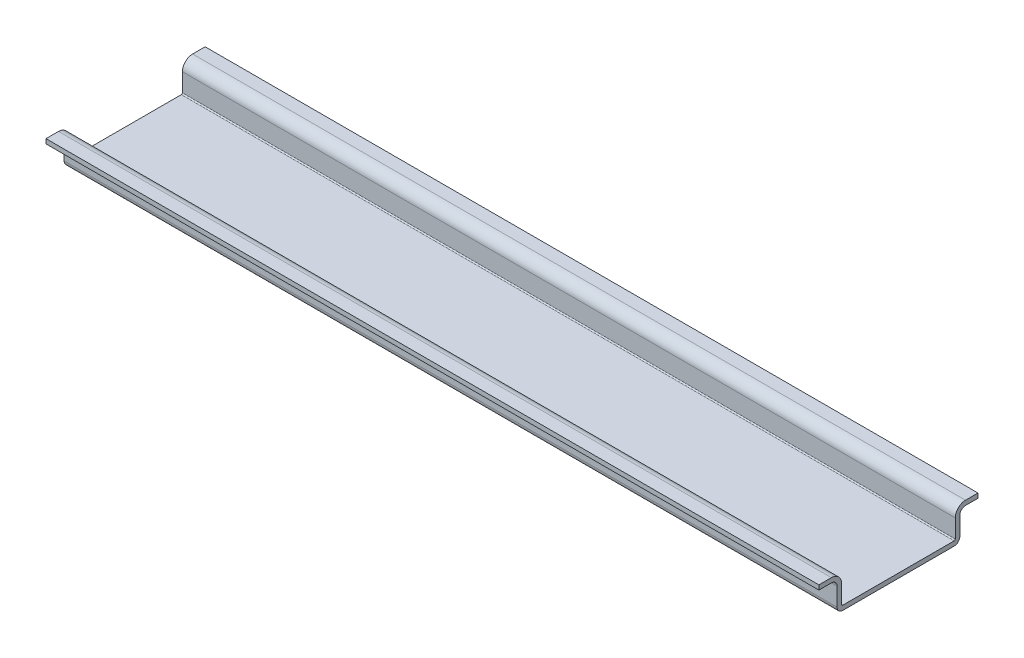
ISO-10303-21;
HEADER;
FILE_DESCRIPTION(('STEP AP214'),'2;1');
FILE_NAME('part.step','',(''),(''),'','','');
FILE_SCHEMA(('AUTOMOTIVE_DESIGN { 1 0 10303 214 1 1 1 1 }'));
ENDSEC;
DATA;
#1=APPLICATION_CONTEXT('core data for automotive mechanical design processes');
#2=APPLICATION_PROTOCOL_DEFINITION('international standard','automotive_design',2000,#1);
#3=PRODUCT_CONTEXT('',#1,'mechanical');
#4=PRODUCT('Part','Part','',(#3));
#5=PRODUCT_RELATED_PRODUCT_CATEGORY('part','',(#4));
#6=PRODUCT_DEFINITION_FORMATION('','',#4);
#7=PRODUCT_DEFINITION_CONTEXT('part definition',#1,'design');
#8=PRODUCT_DEFINITION('design','',#6,#7);
#9=PRODUCT_DEFINITION_SHAPE('','',#8);
#10=(LENGTH_UNIT() NAMED_UNIT(*) SI_UNIT(.MILLI.,.METRE.));
#11=(NAMED_UNIT(*) PLANE_ANGLE_UNIT() SI_UNIT($,.RADIAN.));
#12=(NAMED_UNIT(*) SI_UNIT($,.STERADIAN.) SOLID_ANGLE_UNIT());
#13=UNCERTAINTY_MEASURE_WITH_UNIT(LENGTH_MEASURE(1.E-05),#10,'distance_accuracy_value','');
#14=(GEOMETRIC_REPRESENTATION_CONTEXT(3) GLOBAL_UNCERTAINTY_ASSIGNED_CONTEXT((#13)) GLOBAL_UNIT_ASSIGNED_CONTEXT((#10,
#11,#12)) REPRESENTATION_CONTEXT('',''));
#15=CARTESIAN_POINT('',(0.,0.,0.));
#16=DIRECTION('',(0.,0.,1.));
#17=DIRECTION('',(1.,0.,0.));
#18=AXIS2_PLACEMENT_3D('',#15,#16,#17);
#19=CARTESIAN_POINT('',(85.,6.50000000000017,-17.5));
#20=DIRECTION('',(0.,0.,1.));
#21=DIRECTION('',(1.,0.,0.));
#22=AXIS2_PLACEMENT_3D('',#19,#20,#21);
#23=PLANE('',#22);
#24=DIRECTION('',(0.,1.,0.));
#25=VECTOR('',#24,1.);
#26=CARTESIAN_POINT('',(-85.,6.50000000000017,-17.5));
#27=LINE('',#26,#25);
#28=CARTESIAN_POINT('',(-85.,6.50000000000017,-17.5));
#29=VERTEX_POINT('',#28);
#30=CARTESIAN_POINT('',(-85.,7.5,-17.5));
#31=VERTEX_POINT('',#30);
#32=EDGE_CURVE('E270',#29,#31,#27,.T.);
#33=ORIENTED_EDGE('',*,*,#32,.T.);
#34=DIRECTION('',(-1.,0.,0.));
#35=VECTOR('',#34,1.);
#36=CARTESIAN_POINT('',(85.,7.5,-17.5));
#37=LINE('',#36,#35);
#38=CARTESIAN_POINT('',(85.,7.5,-17.5));
#39=VERTEX_POINT('',#38);
#40=EDGE_CURVE('E13',#39,#31,#37,.T.);
#41=ORIENTED_EDGE('',*,*,#40,.F.);
#42=DIRECTION('',(0.,1.,0.));
#43=VECTOR('',#42,1.);
#44=CARTESIAN_POINT('',(85.,6.50000000000017,-17.5));
#45=LINE('',#44,#43);
#46=CARTESIAN_POINT('',(85.,6.50000000000017,-17.5));
#47=VERTEX_POINT('',#46);
#48=EDGE_CURVE('E308',#47,#39,#45,.T.);
#49=ORIENTED_EDGE('',*,*,#48,.F.);
#50=DIRECTION('',(-1.,0.,0.));
#51=VECTOR('',#50,1.);
#52=CARTESIAN_POINT('',(85.,6.50000000000017,-17.5));
#53=LINE('',#52,#51);
#54=EDGE_CURVE('E266',#47,#29,#53,.T.);
#55=ORIENTED_EDGE('',*,*,#54,.T.);
#56=EDGE_LOOP('',(#33,#41,#49,#55));
#57=FACE_BOUND('',#56,.T.);
#58=ADVANCED_FACE('F102',(#57),#23,.F.);
#59=CARTESIAN_POINT('',(85.,7.5,-14.75));
#60=DIRECTION('',(0.,-1.,0.));
#61=DIRECTION('',(0.,0.,-1.));
#62=AXIS2_PLACEMENT_3D('',#59,#60,#61);
#63=PLANE('',#62);
#64=DIRECTION('',(0.,0.,1.));
#65=VECTOR('',#64,1.);
#66=CARTESIAN_POINT('',(-85.,7.5,-14.75));
#67=LINE('',#66,#65);
#68=CARTESIAN_POINT('',(-85.,7.5,-14.75));
#69=VERTEX_POINT('',#68);
#70=EDGE_CURVE('E273',#31,#69,#67,.T.);
#71=ORIENTED_EDGE('',*,*,#70,.T.);
#72=DIRECTION('',(-1.,0.,0.));
#73=VECTOR('',#72,1.);
#74=CARTESIAN_POINT('',(85.,7.5,-14.75));
#75=LINE('',#74,#73);
#76=CARTESIAN_POINT('',(85.,7.5,-14.75));
#77=VERTEX_POINT('',#76);
#78=EDGE_CURVE('E110',#77,#69,#75,.T.);
#79=ORIENTED_EDGE('',*,*,#78,.F.);
#80=DIRECTION('',(0.,0.,1.));
#81=VECTOR('',#80,1.);
#82=CARTESIAN_POINT('',(85.,7.5,-14.75));
#83=LINE('',#82,#81);
#84=EDGE_CURVE('E197',#39,#77,#83,.T.);
#85=ORIENTED_EDGE('',*,*,#84,.F.);
#86=ORIENTED_EDGE('',*,*,#40,.T.);
#87=EDGE_LOOP('',(#71,#79,#85,#86));
#88=FACE_BOUND('',#87,.T.);
#89=ADVANCED_FACE('F426',(#88),#63,.F.);
#90=CARTESIAN_POINT('',(85.,5.25,-14.75));
#91=DIRECTION('',(-1.,0.,0.));
#92=DIRECTION('',(0.,0.,1.));
#93=AXIS2_PLACEMENT_3D('',#90,#91,#92);
#94=CYLINDRICAL_SURFACE('',#93,2.25);
#95=CARTESIAN_POINT('',(-85.,5.25,-14.75));
#96=DIRECTION('',(1.,0.,0.));
#97=DIRECTION('',(0.,0.,1.));
#98=AXIS2_PLACEMENT_3D('',#95,#96,#97);
#99=CIRCLE('',#98,2.25);
#100=CARTESIAN_POINT('',(-85.,5.24999999999998,-12.5));
#101=VERTEX_POINT('',#100);
#102=EDGE_CURVE('E275',#69,#101,#99,.T.);
#103=ORIENTED_EDGE('',*,*,#102,.T.);
#104=DIRECTION('',(-1.,0.,0.));
#105=VECTOR('',#104,1.);
#106=CARTESIAN_POINT('',(85.,5.24999999999998,-12.5));
#107=LINE('',#106,#105);
#108=CARTESIAN_POINT('',(85.,5.24999999999998,-12.5));
#109=VERTEX_POINT('',#108);
#110=EDGE_CURVE('E351',#109,#101,#107,.T.);
#111=ORIENTED_EDGE('',*,*,#110,.F.);
#112=CARTESIAN_POINT('',(85.,5.25,-14.75));
#113=DIRECTION('',(1.,0.,0.));
#114=DIRECTION('',(0.,0.,1.));
#115=AXIS2_PLACEMENT_3D('',#112,#113,#114);
#116=CIRCLE('',#115,2.25);
#117=EDGE_CURVE('E359',#77,#109,#116,.T.);
#118=ORIENTED_EDGE('',*,*,#117,.F.);
#119=ORIENTED_EDGE('',*,*,#78,.T.);
#120=EDGE_LOOP('',(#103,#111,#118,#119));
#121=FACE_BOUND('',#120,.T.);
#122=ADVANCED_FACE('F357',(#121),#94,.T.);
#123=CARTESIAN_POINT('',(85.,1.24999999999999,-12.5));
#124=DIRECTION('',(0.,0.,-1.));
#125=DIRECTION('',(-1.,0.,0.));
#126=AXIS2_PLACEMENT_3D('',#123,#124,#125);
#127=PLANE('',#126);
#128=DIRECTION('',(0.,-1.,0.));
#129=VECTOR('',#128,1.);
#130=CARTESIAN_POINT('',(-85.,1.24999999999999,-12.5));
#131=LINE('',#130,#129);
#132=CARTESIAN_POINT('',(-85.,1.24999999999997,-12.5));
#133=VERTEX_POINT('',#132);
#134=EDGE_CURVE('E277',#101,#133,#131,.T.);
#135=ORIENTED_EDGE('',*,*,#134,.T.);
#136=DIRECTION('',(-1.,0.,0.));
#137=VECTOR('',#136,1.);
#138=CARTESIAN_POINT('',(85.,1.24999999999997,-12.5));
#139=LINE('',#138,#137);
#140=CARTESIAN_POINT('',(85.,1.24999999999997,-12.5));
#141=VERTEX_POINT('',#140);
#142=EDGE_CURVE('E348',#141,#133,#139,.T.);
#143=ORIENTED_EDGE('',*,*,#142,.F.);
#144=DIRECTION('',(0.,-1.,0.));
#145=VECTOR('',#144,1.);
#146=CARTESIAN_POINT('',(85.,1.24999999999999,-12.5));
#147=LINE('',#146,#145);
#148=EDGE_CURVE('E377',#109,#141,#147,.T.);
#149=ORIENTED_EDGE('',*,*,#148,.F.);
#150=ORIENTED_EDGE('',*,*,#110,.T.);
#151=EDGE_LOOP('',(#135,#143,#149,#150));
#152=FACE_BOUND('',#151,.T.);
#153=ADVANCED_FACE('F368',(#152),#127,.F.);
#154=CARTESIAN_POINT('',(85.,1.24999999999997,-12.25));
#155=DIRECTION('',(-1.,0.,0.));
#156=DIRECTION('',(0.,0.,1.));
#157=AXIS2_PLACEMENT_3D('',#154,#155,#156);
#158=CYLINDRICAL_SURFACE('',#157,0.25);
#159=CARTESIAN_POINT('',(-85.,1.24999999999997,-12.25));
#160=DIRECTION('',(-1.,0.,0.));
#161=DIRECTION('',(0.,0.,-1.));
#162=AXIS2_PLACEMENT_3D('',#159,#160,#161);
#163=CIRCLE('',#162,0.25);
#164=CARTESIAN_POINT('',(-85.,0.999999999999966,-12.25));
#165=VERTEX_POINT('',#164);
#166=EDGE_CURVE('E279',#133,#165,#163,.T.);
#167=ORIENTED_EDGE('',*,*,#166,.T.);
#168=DIRECTION('',(-1.,0.,0.));
#169=VECTOR('',#168,1.);
#170=CARTESIAN_POINT('',(85.,0.999999999999966,-12.25));
#171=LINE('',#170,#169);
#172=CARTESIAN_POINT('',(85.,0.999999999999966,-12.25));
#173=VERTEX_POINT('',#172);
#174=EDGE_CURVE('E345',#173,#165,#171,.T.);
#175=ORIENTED_EDGE('',*,*,#174,.F.);
#176=CARTESIAN_POINT('',(85.,1.24999999999997,-12.25));
#177=DIRECTION('',(-1.,0.,0.));
#178=DIRECTION('',(0.,0.,-1.));
#179=AXIS2_PLACEMENT_3D('',#176,#177,#178);
#180=CIRCLE('',#179,0.25);
#181=EDGE_CURVE('E374',#141,#173,#180,.T.);
#182=ORIENTED_EDGE('',*,*,#181,.F.);
#183=ORIENTED_EDGE('',*,*,#142,.T.);
#184=EDGE_LOOP('',(#167,#175,#182,#183));
#185=FACE_BOUND('',#184,.T.);
#186=ADVANCED_FACE('F372',(#185),#158,.F.);
#187=CARTESIAN_POINT('',(85.,0.999999999999966,-12.25));
#188=DIRECTION('',(0.,-1.,0.));
#189=DIRECTION('',(0.,0.,-1.));
#190=AXIS2_PLACEMENT_3D('',#187,#188,#189);
#191=PLANE('',#190);
#192=DIRECTION('',(0.,0.,1.));
#193=VECTOR('',#192,1.);
#194=CARTESIAN_POINT('',(-85.,0.999999999999966,-12.25));
#195=LINE('',#194,#193);
#196=CARTESIAN_POINT('',(-85.,0.999999999999964,12.25));
#197=VERTEX_POINT('',#196);
#198=EDGE_CURVE('E281',#165,#197,#195,.T.);
#199=ORIENTED_EDGE('',*,*,#198,.T.);
#200=DIRECTION('',(-1.,0.,0.));
#201=VECTOR('',#200,1.);
#202=CARTESIAN_POINT('',(85.,0.999999999999964,12.25));
#203=LINE('',#202,#201);
#204=CARTESIAN_POINT('',(85.,0.999999999999964,12.25));
#205=VERTEX_POINT('',#204);
#206=EDGE_CURVE('E342',#205,#197,#203,.T.);
#207=ORIENTED_EDGE('',*,*,#206,.F.);
#208=DIRECTION('',(0.,0.,1.));
#209=VECTOR('',#208,1.);
#210=CARTESIAN_POINT('',(85.,0.999999999999966,-12.25));
#211=LINE('',#210,#209);
#212=EDGE_CURVE('E376',#173,#205,#211,.T.);
#213=ORIENTED_EDGE('',*,*,#212,.F.);
#214=ORIENTED_EDGE('',*,*,#174,.T.);
#215=EDGE_LOOP('',(#199,#207,#213,#214));
#216=FACE_BOUND('',#215,.T.);
#217=ADVANCED_FACE('F439',(#216),#191,.F.);
#218=CARTESIAN_POINT('',(85.,1.24999999999996,12.25));
#219=DIRECTION('',(-1.,0.,0.));
#220=DIRECTION('',(0.,0.,1.));
#221=AXIS2_PLACEMENT_3D('',#218,#219,#220);
#222=CYLINDRICAL_SURFACE('',#221,0.25);
#223=CARTESIAN_POINT('',(-85.,1.24999999999996,12.25));
#224=DIRECTION('',(-1.,0.,0.));
#225=DIRECTION('',(0.,0.,1.));
#226=AXIS2_PLACEMENT_3D('',#223,#224,#225);
#227=CIRCLE('',#226,0.25);
#228=CARTESIAN_POINT('',(-85.,1.24999999999996,12.5));
#229=VERTEX_POINT('',#228);
#230=EDGE_CURVE('E283',#197,#229,#227,.T.);
#231=ORIENTED_EDGE('',*,*,#230,.T.);
#232=DIRECTION('',(-1.,0.,0.));
#233=VECTOR('',#232,1.);
#234=CARTESIAN_POINT('',(85.,1.24999999999996,12.5));
#235=LINE('',#234,#233);
#236=CARTESIAN_POINT('',(85.,1.24999999999996,12.5));
#237=VERTEX_POINT('',#236);
#238=EDGE_CURVE('E339',#237,#229,#235,.T.);
#239=ORIENTED_EDGE('',*,*,#238,.F.);
#240=CARTESIAN_POINT('',(85.,1.24999999999996,12.25));
#241=DIRECTION('',(-1.,0.,0.));
#242=DIRECTION('',(0.,0.,1.));
#243=AXIS2_PLACEMENT_3D('',#240,#241,#242);
#244=CIRCLE('',#243,0.25);
#245=EDGE_CURVE('E379',#205,#237,#244,.T.);
#246=ORIENTED_EDGE('',*,*,#245,.F.);
#247=ORIENTED_EDGE('',*,*,#206,.T.);
#248=EDGE_LOOP('',(#231,#239,#246,#247));
#249=FACE_BOUND('',#248,.T.);
#250=ADVANCED_FACE('F442',(#249),#222,.F.);
#251=CARTESIAN_POINT('',(85.,1.24999999999996,12.5));
#252=DIRECTION('',(0.,0.,1.));
#253=DIRECTION('',(1.,0.,0.));
#254=AXIS2_PLACEMENT_3D('',#251,#252,#253);
#255=PLANE('',#254);
#256=DIRECTION('',(0.,1.,0.));
#257=VECTOR('',#256,1.);
#258=CARTESIAN_POINT('',(-85.,1.24999999999996,12.5));
#259=LINE('',#258,#257);
#260=CARTESIAN_POINT('',(-85.,5.24999999999997,12.5));
#261=VERTEX_POINT('',#260);
#262=EDGE_CURVE('E285',#229,#261,#259,.T.);
#263=ORIENTED_EDGE('',*,*,#262,.T.);
#264=DIRECTION('',(-1.,0.,0.));
#265=VECTOR('',#264,1.);
#266=CARTESIAN_POINT('',(85.,5.24999999999997,12.5));
#267=LINE('',#266,#265);
#268=CARTESIAN_POINT('',(85.,5.24999999999997,12.5));
#269=VERTEX_POINT('',#268);
#270=EDGE_CURVE('E336',#269,#261,#267,.T.);
#271=ORIENTED_EDGE('',*,*,#270,.F.);
#272=DIRECTION('',(0.,1.,0.));
#273=VECTOR('',#272,1.);
#274=CARTESIAN_POINT('',(85.,1.24999999999996,12.5));
#275=LINE('',#274,#273);
#276=EDGE_CURVE('E385',#237,#269,#275,.T.);
#277=ORIENTED_EDGE('',*,*,#276,.F.);
#278=ORIENTED_EDGE('',*,*,#238,.T.);
#279=EDGE_LOOP('',(#263,#271,#277,#278));
#280=FACE_BOUND('',#279,.T.);
#281=ADVANCED_FACE('F446',(#280),#255,.F.);
#282=CARTESIAN_POINT('',(85.,5.24999999999996,14.75));
#283=DIRECTION('',(-1.,0.,0.));
#284=DIRECTION('',(0.,0.,1.));
#285=AXIS2_PLACEMENT_3D('',#282,#283,#284);
#286=CYLINDRICAL_SURFACE('',#285,2.25);
#287=CARTESIAN_POINT('',(-85.,5.24999999999996,14.75));
#288=DIRECTION('',(1.,0.,0.));
#289=DIRECTION('',(0.,0.,1.));
#290=AXIS2_PLACEMENT_3D('',#287,#288,#289);
#291=CIRCLE('',#290,2.25);
#292=CARTESIAN_POINT('',(-85.,7.49999999999996,14.75));
#293=VERTEX_POINT('',#292);
#294=EDGE_CURVE('E287',#261,#293,#291,.T.);
#295=ORIENTED_EDGE('',*,*,#294,.T.);
#296=DIRECTION('',(-1.,0.,0.));
#297=VECTOR('',#296,1.);
#298=CARTESIAN_POINT('',(85.,7.49999999999996,14.75));
#299=LINE('',#298,#297);
#300=CARTESIAN_POINT('',(85.,7.49999999999996,14.75));
#301=VERTEX_POINT('',#300);
#302=EDGE_CURVE('E333',#301,#293,#299,.T.);
#303=ORIENTED_EDGE('',*,*,#302,.F.);
#304=CARTESIAN_POINT('',(85.,5.24999999999996,14.75));
#305=DIRECTION('',(1.,0.,0.));
#306=DIRECTION('',(0.,0.,1.));
#307=AXIS2_PLACEMENT_3D('',#304,#305,#306);
#308=CIRCLE('',#307,2.25);
#309=EDGE_CURVE('E387',#269,#301,#308,.T.);
#310=ORIENTED_EDGE('',*,*,#309,.F.);
#311=ORIENTED_EDGE('',*,*,#270,.T.);
#312=EDGE_LOOP('',(#295,#303,#310,#311));
#313=FACE_BOUND('',#312,.T.);
#314=ADVANCED_FACE('F450',(#313),#286,.T.);
#315=CARTESIAN_POINT('',(85.,7.49999999999996,14.75));
#316=DIRECTION('',(0.,-1.,0.));
#317=DIRECTION('',(0.,0.,-1.));
#318=AXIS2_PLACEMENT_3D('',#315,#316,#317);
#319=PLANE('',#318);
#320=DIRECTION('',(0.,0.,1.));
#321=VECTOR('',#320,1.);
#322=CARTESIAN_POINT('',(-85.,7.49999999999996,14.75));
#323=LINE('',#322,#321);
#324=CARTESIAN_POINT('',(-85.,7.49999999999996,17.5));
#325=VERTEX_POINT('',#324);
#326=EDGE_CURVE('E289',#293,#325,#323,.T.);
#327=ORIENTED_EDGE('',*,*,#326,.T.);
#328=DIRECTION('',(-1.,0.,0.));
#329=VECTOR('',#328,1.);
#330=CARTESIAN_POINT('',(85.,7.49999999999996,17.5));
#331=LINE('',#330,#329);
#332=CARTESIAN_POINT('',(85.,7.49999999999996,17.5));
#333=VERTEX_POINT('',#332);
#334=EDGE_CURVE('E330',#333,#325,#331,.T.);
#335=ORIENTED_EDGE('',*,*,#334,.F.);
#336=DIRECTION('',(0.,0.,1.));
#337=VECTOR('',#336,1.);
#338=CARTESIAN_POINT('',(85.,7.49999999999996,14.75));
#339=LINE('',#338,#337);
#340=EDGE_CURVE('E389',#301,#333,#339,.T.);
#341=ORIENTED_EDGE('',*,*,#340,.F.);
#342=ORIENTED_EDGE('',*,*,#302,.T.);
#343=EDGE_LOOP('',(#327,#335,#341,#342));
#344=FACE_BOUND('',#343,.T.);
#345=ADVANCED_FACE('F454',(#344),#319,.F.);
#346=CARTESIAN_POINT('',(85.,6.49999999999986,17.5));
#347=DIRECTION('',(0.,0.,-1.));
#348=DIRECTION('',(-1.,0.,0.));
#349=AXIS2_PLACEMENT_3D('',#346,#347,#348);
#350=PLANE('',#349);
#351=DIRECTION('',(0.,-1.,0.));
#352=VECTOR('',#351,1.);
#353=CARTESIAN_POINT('',(-85.,6.49999999999986,17.5));
#354=LINE('',#353,#352);
#355=CARTESIAN_POINT('',(-85.,6.49999999999986,17.5));
#356=VERTEX_POINT('',#355);
#357=EDGE_CURVE('E291',#325,#356,#354,.T.);
#358=ORIENTED_EDGE('',*,*,#357,.T.);
#359=DIRECTION('',(-1.,0.,0.));
#360=VECTOR('',#359,1.);
#361=CARTESIAN_POINT('',(85.,6.49999999999986,17.5));
#362=LINE('',#361,#360);
#363=CARTESIAN_POINT('',(85.,6.49999999999986,17.5));
#364=VERTEX_POINT('',#363);
#365=EDGE_CURVE('E327',#364,#356,#362,.T.);
#366=ORIENTED_EDGE('',*,*,#365,.F.);
#367=DIRECTION('',(0.,-1.,0.));
#368=VECTOR('',#367,1.);
#369=CARTESIAN_POINT('',(85.,6.49999999999986,17.5));
#370=LINE('',#369,#368);
#371=EDGE_CURVE('E391',#333,#364,#370,.T.);
#372=ORIENTED_EDGE('',*,*,#371,.F.);
#373=ORIENTED_EDGE('',*,*,#334,.T.);
#374=EDGE_LOOP('',(#358,#366,#372,#373));
#375=FACE_BOUND('',#374,.T.);
#376=ADVANCED_FACE('F458',(#375),#350,.F.);
#377=CARTESIAN_POINT('',(85.,6.49999999999986,14.75));
#378=DIRECTION('',(0.,1.,0.));
#379=DIRECTION('',(0.,0.,1.));
#380=AXIS2_PLACEMENT_3D('',#377,#378,#379);
#381=PLANE('',#380);
#382=DIRECTION('',(0.,0.,-1.));
#383=VECTOR('',#382,1.);
#384=CARTESIAN_POINT('',(-85.,6.49999999999986,14.75));
#385=LINE('',#384,#383);
#386=CARTESIAN_POINT('',(-85.,6.49999999999986,14.75));
#387=VERTEX_POINT('',#386);
#388=EDGE_CURVE('E293',#356,#387,#385,.T.);
#389=ORIENTED_EDGE('',*,*,#388,.T.);
#390=DIRECTION('',(-1.,0.,0.));
#391=VECTOR('',#390,1.);
#392=CARTESIAN_POINT('',(85.,6.49999999999986,14.75));
#393=LINE('',#392,#391);
#394=CARTESIAN_POINT('',(85.,6.49999999999986,14.75));
#395=VERTEX_POINT('',#394);
#396=EDGE_CURVE('E324',#395,#387,#393,.T.);
#397=ORIENTED_EDGE('',*,*,#396,.F.);
#398=DIRECTION('',(0.,0.,-1.));
#399=VECTOR('',#398,1.);
#400=CARTESIAN_POINT('',(85.,6.49999999999986,14.75));
#401=LINE('',#400,#399);
#402=EDGE_CURVE('E393',#364,#395,#401,.T.);
#403=ORIENTED_EDGE('',*,*,#402,.F.);
#404=ORIENTED_EDGE('',*,*,#365,.T.);
#405=EDGE_LOOP('',(#389,#397,#403,#404));
#406=FACE_BOUND('',#405,.T.);
#407=ADVANCED_FACE('F462',(#406),#381,.F.);
#408=CARTESIAN_POINT('',(85.,5.24999999999986,14.75));
#409=DIRECTION('',(-1.,0.,0.));
#410=DIRECTION('',(0.,0.,1.));
#411=AXIS2_PLACEMENT_3D('',#408,#409,#410);
#412=CYLINDRICAL_SURFACE('',#411,1.25);
#413=CARTESIAN_POINT('',(-85.,5.24999999999986,14.75));
#414=DIRECTION('',(-1.,0.,0.));
#415=DIRECTION('',(0.,0.,1.));
#416=AXIS2_PLACEMENT_3D('',#413,#414,#415);
#417=CIRCLE('',#416,1.25);
#418=CARTESIAN_POINT('',(-85.,5.24999999999986,13.5));
#419=VERTEX_POINT('',#418);
#420=EDGE_CURVE('E295',#387,#419,#417,.T.);
#421=ORIENTED_EDGE('',*,*,#420,.T.);
#422=DIRECTION('',(-1.,0.,0.));
#423=VECTOR('',#422,1.);
#424=CARTESIAN_POINT('',(85.,5.24999999999986,13.5));
#425=LINE('',#424,#423);
#426=CARTESIAN_POINT('',(85.,5.24999999999986,13.5));
#427=VERTEX_POINT('',#426);
#428=EDGE_CURVE('E321',#427,#419,#425,.T.);
#429=ORIENTED_EDGE('',*,*,#428,.F.);
#430=CARTESIAN_POINT('',(85.,5.24999999999986,14.75));
#431=DIRECTION('',(-1.,0.,0.));
#432=DIRECTION('',(0.,0.,1.));
#433=AXIS2_PLACEMENT_3D('',#430,#431,#432);
#434=CIRCLE('',#433,1.25);
#435=EDGE_CURVE('E395',#395,#427,#434,.T.);
#436=ORIENTED_EDGE('',*,*,#435,.F.);
#437=ORIENTED_EDGE('',*,*,#396,.T.);
#438=EDGE_LOOP('',(#421,#429,#436,#437));
#439=FACE_BOUND('',#438,.T.);
#440=ADVANCED_FACE('F466',(#439),#412,.F.);
#441=CARTESIAN_POINT('',(85.,1.25,13.5));
#442=DIRECTION('',(0.,0.,-1.));
#443=DIRECTION('',(-1.,0.,0.));
#444=AXIS2_PLACEMENT_3D('',#441,#442,#443);
#445=PLANE('',#444);
#446=DIRECTION('',(0.,-1.,0.));
#447=VECTOR('',#446,1.);
#448=CARTESIAN_POINT('',(-85.,1.25,13.5));
#449=LINE('',#448,#447);
#450=CARTESIAN_POINT('',(-85.,1.25,13.5));
#451=VERTEX_POINT('',#450);
#452=EDGE_CURVE('E297',#419,#451,#449,.T.);
#453=ORIENTED_EDGE('',*,*,#452,.T.);
#454=DIRECTION('',(-1.,0.,0.));
#455=VECTOR('',#454,1.);
#456=CARTESIAN_POINT('',(85.,1.25,13.5));
#457=LINE('',#456,#455);
#458=CARTESIAN_POINT('',(85.,1.25,13.5));
#459=VERTEX_POINT('',#458);
#460=EDGE_CURVE('E318',#459,#451,#457,.T.);
#461=ORIENTED_EDGE('',*,*,#460,.F.);
#462=DIRECTION('',(0.,-1.,0.));
#463=VECTOR('',#462,1.);
#464=CARTESIAN_POINT('',(85.,1.25,13.5));
#465=LINE('',#464,#463);
#466=EDGE_CURVE('E397',#427,#459,#465,.T.);
#467=ORIENTED_EDGE('',*,*,#466,.F.);
#468=ORIENTED_EDGE('',*,*,#428,.T.);
#469=EDGE_LOOP('',(#453,#461,#467,#468));
#470=FACE_BOUND('',#469,.T.);
#471=ADVANCED_FACE('F470',(#470),#445,.F.);
#472=CARTESIAN_POINT('',(85.,1.25,12.25));
#473=DIRECTION('',(-1.,0.,0.));
#474=DIRECTION('',(0.,0.,1.));
#475=AXIS2_PLACEMENT_3D('',#472,#473,#474);
#476=CYLINDRICAL_SURFACE('',#475,1.25);
#477=CARTESIAN_POINT('',(-85.,1.25,12.25));
#478=DIRECTION('',(1.,0.,0.));
#479=DIRECTION('',(0.,0.,1.));
#480=AXIS2_PLACEMENT_3D('',#477,#478,#479);
#481=CIRCLE('',#480,1.25);
#482=CARTESIAN_POINT('',(-85.,0.,12.25));
#483=VERTEX_POINT('',#482);
#484=EDGE_CURVE('E299',#451,#483,#481,.T.);
#485=ORIENTED_EDGE('',*,*,#484,.T.);
#486=DIRECTION('',(-1.,0.,0.));
#487=VECTOR('',#486,1.);
#488=CARTESIAN_POINT('',(85.,0.,12.25));
#489=LINE('',#488,#487);
#490=CARTESIAN_POINT('',(85.,0.,12.25));
#491=VERTEX_POINT('',#490);
#492=EDGE_CURVE('E315',#491,#483,#489,.T.);
#493=ORIENTED_EDGE('',*,*,#492,.F.);
#494=CARTESIAN_POINT('',(85.,1.25,12.25));
#495=DIRECTION('',(1.,0.,0.));
#496=DIRECTION('',(0.,0.,1.));
#497=AXIS2_PLACEMENT_3D('',#494,#495,#496);
#498=CIRCLE('',#497,1.25);
#499=EDGE_CURVE('E399',#459,#491,#498,.T.);
#500=ORIENTED_EDGE('',*,*,#499,.F.);
#501=ORIENTED_EDGE('',*,*,#460,.T.);
#502=EDGE_LOOP('',(#485,#493,#500,#501));
#503=FACE_BOUND('',#502,.T.);
#504=ADVANCED_FACE('F474',(#503),#476,.T.);
#505=CARTESIAN_POINT('',(85.,0.,-12.25));
#506=DIRECTION('',(0.,1.,0.));
#507=DIRECTION('',(0.,0.,1.));
#508=AXIS2_PLACEMENT_3D('',#505,#506,#507);
#509=PLANE('',#508);
#510=DIRECTION('',(0.,0.,-1.));
#511=VECTOR('',#510,1.);
#512=CARTESIAN_POINT('',(-85.,0.,-12.25));
#513=LINE('',#512,#511);
#514=CARTESIAN_POINT('',(-85.,0.,-12.25));
#515=VERTEX_POINT('',#514);
#516=EDGE_CURVE('E301',#483,#515,#513,.T.);
#517=ORIENTED_EDGE('',*,*,#516,.T.);
#518=DIRECTION('',(-1.,0.,0.));
#519=VECTOR('',#518,1.);
#520=CARTESIAN_POINT('',(85.,0.,-12.25));
#521=LINE('',#520,#519);
#522=CARTESIAN_POINT('',(85.,0.,-12.25));
#523=VERTEX_POINT('',#522);
#524=EDGE_CURVE('E312',#523,#515,#521,.T.);
#525=ORIENTED_EDGE('',*,*,#524,.F.);
#526=DIRECTION('',(0.,0.,-1.));
#527=VECTOR('',#526,1.);
#528=CARTESIAN_POINT('',(85.,0.,-12.25));
#529=LINE('',#528,#527);
#530=EDGE_CURVE('E401',#491,#523,#529,.T.);
#531=ORIENTED_EDGE('',*,*,#530,.F.);
#532=ORIENTED_EDGE('',*,*,#492,.T.);
#533=EDGE_LOOP('',(#517,#525,#531,#532));
#534=FACE_BOUND('',#533,.T.);
#535=ADVANCED_FACE('F407',(#534),#509,.F.);
#536=CARTESIAN_POINT('',(85.,1.25,-12.25));
#537=DIRECTION('',(-1.,0.,0.));
#538=DIRECTION('',(0.,0.,1.));
#539=AXIS2_PLACEMENT_3D('',#536,#537,#538);
#540=CYLINDRICAL_SURFACE('',#539,1.24999999999998);
#541=CARTESIAN_POINT('',(-85.,1.25,-12.25));
#542=DIRECTION('',(1.,0.,0.));
#543=DIRECTION('',(0.,0.,-1.));
#544=AXIS2_PLACEMENT_3D('',#541,#542,#543);
#545=CIRCLE('',#544,1.24999999999998);
#546=CARTESIAN_POINT('',(-85.,1.25,-13.5));
#547=VERTEX_POINT('',#546);
#548=EDGE_CURVE('E303',#515,#547,#545,.T.);
#549=ORIENTED_EDGE('',*,*,#548,.T.);
#550=DIRECTION('',(-1.,0.,0.));
#551=VECTOR('',#550,1.);
#552=CARTESIAN_POINT('',(85.,1.25,-13.5));
#553=LINE('',#552,#551);
#554=CARTESIAN_POINT('',(85.,1.25,-13.5));
#555=VERTEX_POINT('',#554);
#556=EDGE_CURVE('E261',#555,#547,#553,.T.);
#557=ORIENTED_EDGE('',*,*,#556,.F.);
#558=CARTESIAN_POINT('',(85.,1.25,-12.25));
#559=DIRECTION('',(1.,0.,0.));
#560=DIRECTION('',(0.,0.,-1.));
#561=AXIS2_PLACEMENT_3D('',#558,#559,#560);
#562=CIRCLE('',#561,1.24999999999998);
#563=EDGE_CURVE('E252',#523,#555,#562,.T.);
#564=ORIENTED_EDGE('',*,*,#563,.F.);
#565=ORIENTED_EDGE('',*,*,#524,.T.);
#566=EDGE_LOOP('',(#549,#557,#564,#565));
#567=FACE_BOUND('',#566,.T.);
#568=ADVANCED_FACE('F411',(#567),#540,.T.);
#569=CARTESIAN_POINT('',(85.,1.25,-13.5));
#570=DIRECTION('',(0.,0.,1.));
#571=DIRECTION('',(1.,0.,0.));
#572=AXIS2_PLACEMENT_3D('',#569,#570,#571);
#573=PLANE('',#572);
#574=DIRECTION('',(0.,1.,0.));
#575=VECTOR('',#574,1.);
#576=CARTESIAN_POINT('',(-85.,1.25,-13.5));
#577=LINE('',#576,#575);
#578=CARTESIAN_POINT('',(-85.,5.25000000000017,-13.5));
#579=VERTEX_POINT('',#578);
#580=EDGE_CURVE('E260',#547,#579,#577,.T.);
#581=ORIENTED_EDGE('',*,*,#580,.T.);
#582=DIRECTION('',(-1.,0.,0.));
#583=VECTOR('',#582,1.);
#584=CARTESIAN_POINT('',(85.,5.25000000000017,-13.5));
#585=LINE('',#584,#583);
#586=CARTESIAN_POINT('',(85.,5.25000000000017,-13.5));
#587=VERTEX_POINT('',#586);
#588=EDGE_CURVE('E257',#587,#579,#585,.T.);
#589=ORIENTED_EDGE('',*,*,#588,.F.);
#590=DIRECTION('',(0.,1.,0.));
#591=VECTOR('',#590,1.);
#592=CARTESIAN_POINT('',(85.,1.25,-13.5));
#593=LINE('',#592,#591);
#594=EDGE_CURVE('E246',#555,#587,#593,.T.);
#595=ORIENTED_EDGE('',*,*,#594,.F.);
#596=ORIENTED_EDGE('',*,*,#556,.T.);
#597=EDGE_LOOP('',(#581,#589,#595,#596));
#598=FACE_BOUND('',#597,.T.);
#599=ADVANCED_FACE('F258',(#598),#573,.F.);
#600=CARTESIAN_POINT('',(85.,5.25000000000017,-14.75));
#601=DIRECTION('',(-1.,0.,0.));
#602=DIRECTION('',(0.,0.,1.));
#603=AXIS2_PLACEMENT_3D('',#600,#601,#602);
#604=CYLINDRICAL_SURFACE('',#603,1.25);
#605=CARTESIAN_POINT('',(-85.,5.25000000000017,-14.75));
#606=DIRECTION('',(-1.,0.,0.));
#607=DIRECTION('',(0.,0.,1.));
#608=AXIS2_PLACEMENT_3D('',#605,#606,#607);
#609=CIRCLE('',#608,1.25);
#610=CARTESIAN_POINT('',(-85.,6.50000000000017,-14.75));
#611=VERTEX_POINT('',#610);
#612=EDGE_CURVE('E183',#579,#611,#609,.T.);
#613=ORIENTED_EDGE('',*,*,#612,.T.);
#614=DIRECTION('',(-1.,0.,0.));
#615=VECTOR('',#614,1.);
#616=CARTESIAN_POINT('',(85.,6.50000000000017,-14.75));
#617=LINE('',#616,#615);
#618=CARTESIAN_POINT('',(85.,6.50000000000017,-14.75));
#619=VERTEX_POINT('',#618);
#620=EDGE_CURVE('E262',#619,#611,#617,.T.);
#621=ORIENTED_EDGE('',*,*,#620,.F.);
#622=CARTESIAN_POINT('',(85.,5.25000000000017,-14.75));
#623=DIRECTION('',(-1.,0.,0.));
#624=DIRECTION('',(0.,0.,1.));
#625=AXIS2_PLACEMENT_3D('',#622,#623,#624);
#626=CIRCLE('',#625,1.25);
#627=EDGE_CURVE('E250',#587,#619,#626,.T.);
#628=ORIENTED_EDGE('',*,*,#627,.F.);
#629=ORIENTED_EDGE('',*,*,#588,.T.);
#630=EDGE_LOOP('',(#613,#621,#628,#629));
#631=FACE_BOUND('',#630,.T.);
#632=ADVANCED_FACE('F264',(#631),#604,.F.);
#633=CARTESIAN_POINT('',(85.,6.50000000000017,-14.75));
#634=DIRECTION('',(0.,1.,0.));
#635=DIRECTION('',(0.,0.,1.));
#636=AXIS2_PLACEMENT_3D('',#633,#634,#635);
#637=PLANE('',#636);
#638=DIRECTION('',(0.,0.,-1.));
#639=VECTOR('',#638,1.);
#640=CARTESIAN_POINT('',(-85.,6.50000000000017,-14.75));
#641=LINE('',#640,#639);
#642=EDGE_CURVE('E189',#611,#29,#641,.T.);
#643=ORIENTED_EDGE('',*,*,#642,.T.);
#644=ORIENTED_EDGE('',*,*,#54,.F.);
#645=DIRECTION('',(0.,0.,-1.));
#646=VECTOR('',#645,1.);
#647=CARTESIAN_POINT('',(85.,6.50000000000017,-14.75));
#648=LINE('',#647,#646);
#649=EDGE_CURVE('E118',#619,#47,#648,.T.);
#650=ORIENTED_EDGE('',*,*,#649,.F.);
#651=ORIENTED_EDGE('',*,*,#620,.T.);
#652=EDGE_LOOP('',(#643,#644,#650,#651));
#653=FACE_BOUND('',#652,.T.);
#654=ADVANCED_FACE('F415',(#653),#637,.F.);
#655=CARTESIAN_POINT('',(85.,5.25,-14.75));
#656=DIRECTION('',(-1.,0.,0.));
#657=DIRECTION('',(0.,0.,1.));
#658=AXIS2_PLACEMENT_3D('',#655,#656,#657);
#659=PLANE('',#658);
#660=ORIENTED_EDGE('',*,*,#48,.T.);
#661=ORIENTED_EDGE('',*,*,#84,.T.);
#662=ORIENTED_EDGE('',*,*,#117,.T.);
#663=ORIENTED_EDGE('',*,*,#148,.T.);
#664=ORIENTED_EDGE('',*,*,#181,.T.);
#665=ORIENTED_EDGE('',*,*,#212,.T.);
#666=ORIENTED_EDGE('',*,*,#245,.T.);
#667=ORIENTED_EDGE('',*,*,#276,.T.);
#668=ORIENTED_EDGE('',*,*,#309,.T.);
#669=ORIENTED_EDGE('',*,*,#340,.T.);
#670=ORIENTED_EDGE('',*,*,#371,.T.);
#671=ORIENTED_EDGE('',*,*,#402,.T.);
#672=ORIENTED_EDGE('',*,*,#435,.T.);
#673=ORIENTED_EDGE('',*,*,#466,.T.);
#674=ORIENTED_EDGE('',*,*,#499,.T.);
#675=ORIENTED_EDGE('',*,*,#530,.T.);
#676=ORIENTED_EDGE('',*,*,#563,.T.);
#677=ORIENTED_EDGE('',*,*,#594,.T.);
#678=ORIENTED_EDGE('',*,*,#627,.T.);
#679=ORIENTED_EDGE('',*,*,#649,.T.);
#680=EDGE_LOOP('',(#660,#661,#662,#663,#664,#665,#666,#667,#668,#669,#670,#671,#672,#673,#674,
#675,#676,#677,#678,#679));
#681=FACE_BOUND('',#680,.T.);
#682=ADVANCED_FACE('F248',(#681),#659,.F.);
#683=CARTESIAN_POINT('',(-85.,5.25,-14.75));
#684=DIRECTION('',(-1.,0.,0.));
#685=DIRECTION('',(0.,0.,1.));
#686=AXIS2_PLACEMENT_3D('',#683,#684,#685);
#687=PLANE('',#686);
#688=ORIENTED_EDGE('',*,*,#32,.F.);
#689=ORIENTED_EDGE('',*,*,#642,.F.);
#690=ORIENTED_EDGE('',*,*,#612,.F.);
#691=ORIENTED_EDGE('',*,*,#580,.F.);
#692=ORIENTED_EDGE('',*,*,#548,.F.);
#693=ORIENTED_EDGE('',*,*,#516,.F.);
#694=ORIENTED_EDGE('',*,*,#484,.F.);
#695=ORIENTED_EDGE('',*,*,#452,.F.);
#696=ORIENTED_EDGE('',*,*,#420,.F.);
#697=ORIENTED_EDGE('',*,*,#388,.F.);
#698=ORIENTED_EDGE('',*,*,#357,.F.);
#699=ORIENTED_EDGE('',*,*,#326,.F.);
#700=ORIENTED_EDGE('',*,*,#294,.F.);
#701=ORIENTED_EDGE('',*,*,#262,.F.);
#702=ORIENTED_EDGE('',*,*,#230,.F.);
#703=ORIENTED_EDGE('',*,*,#198,.F.);
#704=ORIENTED_EDGE('',*,*,#166,.F.);
#705=ORIENTED_EDGE('',*,*,#134,.F.);
#706=ORIENTED_EDGE('',*,*,#102,.F.);
#707=ORIENTED_EDGE('',*,*,#70,.F.);
#708=EDGE_LOOP('',(#688,#689,#690,#691,#692,#693,#694,#695,#696,#697,#698,#699,#700,#701,#702,
#703,#704,#705,#706,#707));
#709=FACE_BOUND('',#708,.T.);
#710=ADVANCED_FACE('F363',(#709),#687,.T.);
#711=CLOSED_SHELL('',(#58,#89,#122,#153,#186,#217,#250,#281,#314,#345,#376,#407,#440,#471,#504,
#535,#568,#599,#632,#654,#682,#710));
#712=MANIFOLD_SOLID_BREP('B2',#711);
#713=ADVANCED_BREP_SHAPE_REPRESENTATION('',(#18,#712),#14);
#714=SHAPE_DEFINITION_REPRESENTATION(#9,#713);
ENDSEC;
END-ISO-10303-21;
